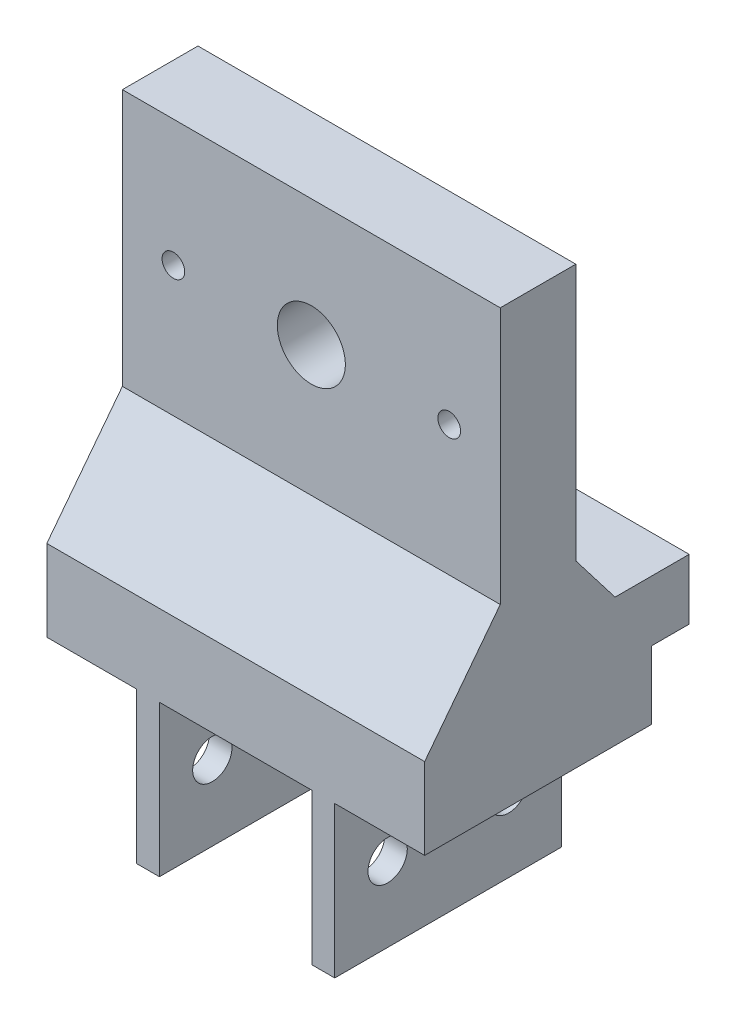
ISO-10303-21;
HEADER;
FILE_DESCRIPTION(('STEP AP214'),'2;1');
FILE_NAME('part.step','',(''),(''),'','','');
FILE_SCHEMA(('AUTOMOTIVE_DESIGN { 1 0 10303 214 1 1 1 1 }'));
ENDSEC;
DATA;
#1=APPLICATION_CONTEXT('core data for automotive mechanical design processes');
#2=APPLICATION_PROTOCOL_DEFINITION('international standard','automotive_design',2000,#1);
#3=PRODUCT_CONTEXT('',#1,'mechanical');
#4=PRODUCT('Part','Part','',(#3));
#5=PRODUCT_RELATED_PRODUCT_CATEGORY('part','',(#4));
#6=PRODUCT_DEFINITION_FORMATION('','',#4);
#7=PRODUCT_DEFINITION_CONTEXT('part definition',#1,'design');
#8=PRODUCT_DEFINITION('design','',#6,#7);
#9=PRODUCT_DEFINITION_SHAPE('','',#8);
#10=(LENGTH_UNIT() NAMED_UNIT(*) SI_UNIT(.MILLI.,.METRE.));
#11=(NAMED_UNIT(*) PLANE_ANGLE_UNIT() SI_UNIT($,.RADIAN.));
#12=(NAMED_UNIT(*) SI_UNIT($,.STERADIAN.) SOLID_ANGLE_UNIT());
#13=UNCERTAINTY_MEASURE_WITH_UNIT(LENGTH_MEASURE(1.E-05),#10,'distance_accuracy_value','');
#14=(GEOMETRIC_REPRESENTATION_CONTEXT(3) GLOBAL_UNCERTAINTY_ASSIGNED_CONTEXT((#13)) GLOBAL_UNIT_ASSIGNED_CONTEXT((#10,
#11,#12)) REPRESENTATION_CONTEXT('',''));
#15=CARTESIAN_POINT('',(0.,0.,0.));
#16=DIRECTION('',(0.,0.,1.));
#17=DIRECTION('',(1.,0.,0.));
#18=AXIS2_PLACEMENT_3D('',#15,#16,#17);
#19=CARTESIAN_POINT('',(13.1,0.,30.));
#20=DIRECTION('',(1.,0.,0.));
#21=DIRECTION('',(0.,1.,0.));
#22=AXIS2_PLACEMENT_3D('',#19,#20,#21);
#23=PLANE('',#22);
#24=CARTESIAN_POINT('',(13.1,-15.375,7.));
#25=DIRECTION('',(1.,0.,0.));
#26=DIRECTION('',(0.,1.,0.));
#27=AXIS2_PLACEMENT_3D('',#24,#25,#26);
#28=CIRCLE('',#27,2.60000000000001);
#29=CARTESIAN_POINT('',(13.1,-12.775,7.));
#30=VERTEX_POINT('',#29);
#31=EDGE_CURVE('E263',#30,#30,#28,.T.);
#32=ORIENTED_EDGE('',*,*,#31,.F.);
#33=EDGE_LOOP('',(#32));
#34=FACE_BOUND('',#33,.T.);
#35=CARTESIAN_POINT('',(13.1,-15.375,23.));
#36=DIRECTION('',(1.,0.,0.));
#37=DIRECTION('',(0.,1.,0.));
#38=AXIS2_PLACEMENT_3D('',#35,#36,#37);
#39=CIRCLE('',#38,2.60000000000001);
#40=CARTESIAN_POINT('',(13.1,-12.775,23.));
#41=VERTEX_POINT('',#40);
#42=EDGE_CURVE('E273',#41,#41,#39,.T.);
#43=ORIENTED_EDGE('',*,*,#42,.F.);
#44=EDGE_LOOP('',(#43));
#45=FACE_BOUND('',#44,.T.);
#46=DIRECTION('',(0.,-1.,0.));
#47=VECTOR('',#46,1.);
#48=CARTESIAN_POINT('',(13.1,0.,0.));
#49=LINE('',#48,#47);
#50=CARTESIAN_POINT('',(13.1,-5.375,0.));
#51=VERTEX_POINT('',#50);
#52=CARTESIAN_POINT('',(13.1,-25.375,0.));
#53=VERTEX_POINT('',#52);
#54=EDGE_CURVE('E285',#51,#53,#49,.T.);
#55=ORIENTED_EDGE('',*,*,#54,.F.);
#56=DIRECTION('',(0.,0.,-1.));
#57=VECTOR('',#56,1.);
#58=CARTESIAN_POINT('',(13.1,-5.375,30.));
#59=LINE('',#58,#57);
#60=CARTESIAN_POINT('',(13.1,-5.375,30.));
#61=VERTEX_POINT('',#60);
#62=EDGE_CURVE('E360',#61,#51,#59,.T.);
#63=ORIENTED_EDGE('',*,*,#62,.F.);
#64=DIRECTION('',(0.,-1.,0.));
#65=VECTOR('',#64,1.);
#66=CARTESIAN_POINT('',(13.1,0.,30.));
#67=LINE('',#66,#65);
#68=CARTESIAN_POINT('',(13.1,-25.375,30.));
#69=VERTEX_POINT('',#68);
#70=EDGE_CURVE('E286',#61,#69,#67,.T.);
#71=ORIENTED_EDGE('',*,*,#70,.T.);
#72=DIRECTION('',(0.,0.,-1.));
#73=VECTOR('',#72,1.);
#74=CARTESIAN_POINT('',(13.1,-25.375,30.));
#75=LINE('',#74,#73);
#76=EDGE_CURVE('E316',#69,#53,#75,.T.);
#77=ORIENTED_EDGE('',*,*,#76,.T.);
#78=EDGE_LOOP('',(#55,#63,#71,#77));
#79=FACE_BOUND('',#78,.T.);
#80=ADVANCED_FACE('F41',(#34,#45,#79),#23,.T.);
#81=CARTESIAN_POINT('',(0.,-5.375,30.));
#82=DIRECTION('',(0.,1.,0.));
#83=DIRECTION('',(0.,0.,1.));
#84=AXIS2_PLACEMENT_3D('',#81,#82,#83);
#85=PLANE('',#84);
#86=DIRECTION('',(1.,0.,0.));
#87=VECTOR('',#86,1.);
#88=CARTESIAN_POINT('',(0.,-5.375,0.));
#89=LINE('',#88,#87);
#90=CARTESIAN_POINT('',(25.,-5.375,0.));
#91=VERTEX_POINT('',#90);
#92=EDGE_CURVE('E319',#51,#91,#89,.T.);
#93=ORIENTED_EDGE('',*,*,#92,.T.);
#94=DIRECTION('',(0.,0.,-1.));
#95=VECTOR('',#94,1.);
#96=CARTESIAN_POINT('',(25.,-5.375,30.));
#97=LINE('',#96,#95);
#98=CARTESIAN_POINT('',(25.,-5.375,30.));
#99=VERTEX_POINT('',#98);
#100=EDGE_CURVE('E358',#99,#91,#97,.T.);
#101=ORIENTED_EDGE('',*,*,#100,.F.);
#102=DIRECTION('',(1.,0.,0.));
#103=VECTOR('',#102,1.);
#104=CARTESIAN_POINT('',(0.,-5.375,30.));
#105=LINE('',#104,#103);
#106=EDGE_CURVE('E289',#61,#99,#105,.T.);
#107=ORIENTED_EDGE('',*,*,#106,.F.);
#108=ORIENTED_EDGE('',*,*,#62,.T.);
#109=EDGE_LOOP('',(#93,#101,#107,#108));
#110=FACE_BOUND('',#109,.T.);
#111=ADVANCED_FACE('F459',(#110),#85,.F.);
#112=CARTESIAN_POINT('',(25.,0.,30.));
#113=DIRECTION('',(-1.,0.,0.));
#114=DIRECTION('',(0.,0.,1.));
#115=AXIS2_PLACEMENT_3D('',#112,#113,#114);
#116=PLANE('',#115);
#117=DIRECTION('',(0.,0.,1.));
#118=VECTOR('',#117,1.);
#119=CARTESIAN_POINT('',(25.,11.625,-5.));
#120=LINE('',#119,#118);
#121=CARTESIAN_POINT('',(25.,11.625,-5.));
#122=VERTEX_POINT('',#121);
#123=CARTESIAN_POINT('',(25.,11.625,4.80769230769231));
#124=VERTEX_POINT('',#123);
#125=EDGE_CURVE('E179',#122,#124,#120,.T.);
#126=ORIENTED_EDGE('',*,*,#125,.T.);
#127=DIRECTION('',(0.,0.7926239891046,0.609710760849693));
#128=VECTOR('',#127,1.);
#129=CARTESIAN_POINT('',(25.,18.375,10.));
#130=LINE('',#129,#128);
#131=CARTESIAN_POINT('',(25.,18.375,10.));
#132=VERTEX_POINT('',#131);
#133=EDGE_CURVE('E215',#124,#132,#130,.T.);
#134=ORIENTED_EDGE('',*,*,#133,.T.);
#135=DIRECTION('',(0.,-1.,0.));
#136=VECTOR('',#135,1.);
#137=CARTESIAN_POINT('',(25.,55.375,10.));
#138=LINE('',#137,#136);
#139=CARTESIAN_POINT('',(25.,52.375,10.));
#140=VERTEX_POINT('',#139);
#141=EDGE_CURVE('E278',#140,#132,#138,.T.);
#142=ORIENTED_EDGE('',*,*,#141,.F.);
#143=DIRECTION('',(0.,0.,1.));
#144=VECTOR('',#143,1.);
#145=CARTESIAN_POINT('',(25.,52.375,20.));
#146=LINE('',#145,#144);
#147=CARTESIAN_POINT('',(25.,52.375,20.));
#148=VERTEX_POINT('',#147);
#149=EDGE_CURVE('E207',#140,#148,#146,.T.);
#150=ORIENTED_EDGE('',*,*,#149,.T.);
#151=DIRECTION('',(0.,-1.,0.));
#152=VECTOR('',#151,1.);
#153=CARTESIAN_POINT('',(25.,55.375,20.));
#154=LINE('',#153,#152);
#155=CARTESIAN_POINT('',(25.,18.375,20.));
#156=VERTEX_POINT('',#155);
#157=EDGE_CURVE('E281',#148,#156,#154,.T.);
#158=ORIENTED_EDGE('',*,*,#157,.T.);
#159=DIRECTION('',(0.,-0.7926239891046,0.609710760849692));
#160=VECTOR('',#159,1.);
#161=CARTESIAN_POINT('',(25.,18.375,20.));
#162=LINE('',#161,#160);
#163=CARTESIAN_POINT('',(25.,5.375,30.));
#164=VERTEX_POINT('',#163);
#165=EDGE_CURVE('E225',#156,#164,#162,.T.);
#166=ORIENTED_EDGE('',*,*,#165,.T.);
#167=DIRECTION('',(0.,1.,0.));
#168=VECTOR('',#167,1.);
#169=CARTESIAN_POINT('',(25.,0.,30.));
#170=LINE('',#169,#168);
#171=EDGE_CURVE('E292',#99,#164,#170,.T.);
#172=ORIENTED_EDGE('',*,*,#171,.F.);
#173=ORIENTED_EDGE('',*,*,#100,.T.);
#174=DIRECTION('',(0.,1.,0.));
#175=VECTOR('',#174,1.);
#176=CARTESIAN_POINT('',(25.,0.,0.));
#177=LINE('',#176,#175);
#178=CARTESIAN_POINT('',(25.,3.625,0.));
#179=VERTEX_POINT('',#178);
#180=EDGE_CURVE('E176',#91,#179,#177,.T.);
#181=ORIENTED_EDGE('',*,*,#180,.T.);
#182=DIRECTION('',(0.,0.,-1.));
#183=VECTOR('',#182,1.);
#184=CARTESIAN_POINT('',(25.,3.625,-5.));
#185=LINE('',#184,#183);
#186=CARTESIAN_POINT('',(25.,3.625,-5.));
#187=VERTEX_POINT('',#186);
#188=EDGE_CURVE('E169',#179,#187,#185,.T.);
#189=ORIENTED_EDGE('',*,*,#188,.T.);
#190=DIRECTION('',(0.,1.,0.));
#191=VECTOR('',#190,1.);
#192=CARTESIAN_POINT('',(25.,3.625,-5.));
#193=LINE('',#192,#191);
#194=EDGE_CURVE('E174',#187,#122,#193,.T.);
#195=ORIENTED_EDGE('',*,*,#194,.T.);
#196=EDGE_LOOP('',(#126,#134,#142,#150,#158,#166,#172,#173,#181,#189,#195));
#197=FACE_BOUND('',#196,.T.);
#198=ADVANCED_FACE('F172',(#197),#116,.F.);
#199=CARTESIAN_POINT('',(-25.,0.,30.));
#200=DIRECTION('',(-1.,0.,0.));
#201=DIRECTION('',(0.,0.,1.));
#202=AXIS2_PLACEMENT_3D('',#199,#200,#201);
#203=PLANE('',#202);
#204=DIRECTION('',(0.,-0.7926239891046,-0.609710760849693));
#205=VECTOR('',#204,1.);
#206=CARTESIAN_POINT('',(-25.,18.375,10.));
#207=LINE('',#206,#205);
#208=CARTESIAN_POINT('',(-25.,18.375,10.));
#209=VERTEX_POINT('',#208);
#210=CARTESIAN_POINT('',(-25.,11.625,4.80769230769231));
#211=VERTEX_POINT('',#210);
#212=EDGE_CURVE('E221',#209,#211,#207,.T.);
#213=ORIENTED_EDGE('',*,*,#212,.T.);
#214=DIRECTION('',(0.,0.,1.));
#215=VECTOR('',#214,1.);
#216=CARTESIAN_POINT('',(-25.,11.625,-5.));
#217=LINE('',#216,#215);
#218=CARTESIAN_POINT('',(-25.,11.625,-5.));
#219=VERTEX_POINT('',#218);
#220=EDGE_CURVE('E178',#219,#211,#217,.T.);
#221=ORIENTED_EDGE('',*,*,#220,.F.);
#222=DIRECTION('',(0.,1.,0.));
#223=VECTOR('',#222,1.);
#224=CARTESIAN_POINT('',(-25.,3.625,-5.));
#225=LINE('',#224,#223);
#226=CARTESIAN_POINT('',(-25.,3.625,-5.));
#227=VERTEX_POINT('',#226);
#228=EDGE_CURVE('E189',#227,#219,#225,.T.);
#229=ORIENTED_EDGE('',*,*,#228,.F.);
#230=DIRECTION('',(0.,0.,-1.));
#231=VECTOR('',#230,1.);
#232=CARTESIAN_POINT('',(-25.,3.625,-5.));
#233=LINE('',#232,#231);
#234=CARTESIAN_POINT('',(-25.,3.625,0.));
#235=VERTEX_POINT('',#234);
#236=EDGE_CURVE('E185',#235,#227,#233,.T.);
#237=ORIENTED_EDGE('',*,*,#236,.F.);
#238=DIRECTION('',(0.,1.,0.));
#239=VECTOR('',#238,1.);
#240=CARTESIAN_POINT('',(-25.,0.,0.));
#241=LINE('',#240,#239);
#242=CARTESIAN_POINT('',(-25.,-5.375,0.));
#243=VERTEX_POINT('',#242);
#244=EDGE_CURVE('E58',#243,#235,#241,.T.);
#245=ORIENTED_EDGE('',*,*,#244,.F.);
#246=DIRECTION('',(0.,0.,-1.));
#247=VECTOR('',#246,1.);
#248=CARTESIAN_POINT('',(-25.,-5.375,30.));
#249=LINE('',#248,#247);
#250=CARTESIAN_POINT('',(-25.,-5.375,30.));
#251=VERTEX_POINT('',#250);
#252=EDGE_CURVE('E356',#251,#243,#249,.T.);
#253=ORIENTED_EDGE('',*,*,#252,.F.);
#254=DIRECTION('',(0.,1.,0.));
#255=VECTOR('',#254,1.);
#256=CARTESIAN_POINT('',(-25.,0.,30.));
#257=LINE('',#256,#255);
#258=CARTESIAN_POINT('',(-25.,5.375,30.));
#259=VERTEX_POINT('',#258);
#260=EDGE_CURVE('E298',#251,#259,#257,.T.);
#261=ORIENTED_EDGE('',*,*,#260,.T.);
#262=DIRECTION('',(0.,0.7926239891046,-0.609710760849692));
#263=VECTOR('',#262,1.);
#264=CARTESIAN_POINT('',(-25.,18.375,20.));
#265=LINE('',#264,#263);
#266=CARTESIAN_POINT('',(-25.,18.375,20.));
#267=VERTEX_POINT('',#266);
#268=EDGE_CURVE('E224',#259,#267,#265,.T.);
#269=ORIENTED_EDGE('',*,*,#268,.T.);
#270=DIRECTION('',(0.,-1.,0.));
#271=VECTOR('',#270,1.);
#272=CARTESIAN_POINT('',(-25.,55.375,20.));
#273=LINE('',#272,#271);
#274=CARTESIAN_POINT('',(-25.,52.375,20.));
#275=VERTEX_POINT('',#274);
#276=EDGE_CURVE('E283',#275,#267,#273,.T.);
#277=ORIENTED_EDGE('',*,*,#276,.F.);
#278=DIRECTION('',(0.,0.,1.));
#279=VECTOR('',#278,1.);
#280=CARTESIAN_POINT('',(-25.,52.375,20.));
#281=LINE('',#280,#279);
#282=CARTESIAN_POINT('',(-25.,52.375,10.));
#283=VERTEX_POINT('',#282);
#284=EDGE_CURVE('E206',#283,#275,#281,.T.);
#285=ORIENTED_EDGE('',*,*,#284,.F.);
#286=DIRECTION('',(0.,-1.,0.));
#287=VECTOR('',#286,1.);
#288=CARTESIAN_POINT('',(-25.,55.375,10.));
#289=LINE('',#288,#287);
#290=EDGE_CURVE('E276',#283,#209,#289,.T.);
#291=ORIENTED_EDGE('',*,*,#290,.T.);
#292=EDGE_LOOP('',(#213,#221,#229,#237,#245,#253,#261,#269,#277,#285,#291));
#293=FACE_BOUND('',#292,.T.);
#294=ADVANCED_FACE('F390',(#293),#203,.T.);
#295=CARTESIAN_POINT('',(0.,-5.375,30.));
#296=DIRECTION('',(0.,1.,0.));
#297=DIRECTION('',(0.,0.,1.));
#298=AXIS2_PLACEMENT_3D('',#295,#296,#297);
#299=PLANE('',#298);
#300=DIRECTION('',(1.,0.,0.));
#301=VECTOR('',#300,1.);
#302=CARTESIAN_POINT('',(0.,-5.375,0.));
#303=LINE('',#302,#301);
#304=CARTESIAN_POINT('',(-13.1,-5.375,0.));
#305=VERTEX_POINT('',#304);
#306=EDGE_CURVE('E323',#243,#305,#303,.T.);
#307=ORIENTED_EDGE('',*,*,#306,.T.);
#308=DIRECTION('',(0.,0.,-1.));
#309=VECTOR('',#308,1.);
#310=CARTESIAN_POINT('',(-13.1,-5.375,30.));
#311=LINE('',#310,#309);
#312=CARTESIAN_POINT('',(-13.1,-5.375,30.));
#313=VERTEX_POINT('',#312);
#314=EDGE_CURVE('E353',#313,#305,#311,.T.);
#315=ORIENTED_EDGE('',*,*,#314,.F.);
#316=DIRECTION('',(1.,0.,0.));
#317=VECTOR('',#316,1.);
#318=CARTESIAN_POINT('',(0.,-5.375,30.));
#319=LINE('',#318,#317);
#320=EDGE_CURVE('E301',#251,#313,#319,.T.);
#321=ORIENTED_EDGE('',*,*,#320,.F.);
#322=ORIENTED_EDGE('',*,*,#252,.T.);
#323=EDGE_LOOP('',(#307,#315,#321,#322));
#324=FACE_BOUND('',#323,.T.);
#325=ADVANCED_FACE('F494',(#324),#299,.F.);
#326=CARTESIAN_POINT('',(-13.1,0.,30.));
#327=DIRECTION('',(1.,0.,0.));
#328=DIRECTION('',(0.,1.,0.));
#329=AXIS2_PLACEMENT_3D('',#326,#327,#328);
#330=PLANE('',#329);
#331=CARTESIAN_POINT('',(-13.1,-15.375,7.));
#332=DIRECTION('',(-1.,0.,0.));
#333=DIRECTION('',(0.,0.,1.));
#334=AXIS2_PLACEMENT_3D('',#331,#332,#333);
#335=CIRCLE('',#334,2.60000000000001);
#336=CARTESIAN_POINT('',(-13.1,-15.375,9.60000000000001));
#337=VERTEX_POINT('',#336);
#338=EDGE_CURVE('E256',#337,#337,#335,.T.);
#339=ORIENTED_EDGE('',*,*,#338,.F.);
#340=EDGE_LOOP('',(#339));
#341=FACE_BOUND('',#340,.T.);
#342=CARTESIAN_POINT('',(-13.1,-15.375,23.));
#343=DIRECTION('',(-1.,0.,0.));
#344=DIRECTION('',(0.,0.,1.));
#345=AXIS2_PLACEMENT_3D('',#342,#343,#344);
#346=CIRCLE('',#345,2.60000000000001);
#347=CARTESIAN_POINT('',(-13.1,-15.375,25.6));
#348=VERTEX_POINT('',#347);
#349=EDGE_CURVE('E266',#348,#348,#346,.T.);
#350=ORIENTED_EDGE('',*,*,#349,.F.);
#351=EDGE_LOOP('',(#350));
#352=FACE_BOUND('',#351,.T.);
#353=DIRECTION('',(0.,-1.,0.));
#354=VECTOR('',#353,1.);
#355=CARTESIAN_POINT('',(-13.1,0.,0.));
#356=LINE('',#355,#354);
#357=CARTESIAN_POINT('',(-13.1,-25.375,0.));
#358=VERTEX_POINT('',#357);
#359=EDGE_CURVE('E325',#305,#358,#356,.T.);
#360=ORIENTED_EDGE('',*,*,#359,.T.);
#361=DIRECTION('',(0.,0.,-1.));
#362=VECTOR('',#361,1.);
#363=CARTESIAN_POINT('',(-13.1,-25.375,30.));
#364=LINE('',#363,#362);
#365=CARTESIAN_POINT('',(-13.1,-25.375,30.));
#366=VERTEX_POINT('',#365);
#367=EDGE_CURVE('E350',#366,#358,#364,.T.);
#368=ORIENTED_EDGE('',*,*,#367,.F.);
#369=DIRECTION('',(0.,-1.,0.));
#370=VECTOR('',#369,1.);
#371=CARTESIAN_POINT('',(-13.1,0.,30.));
#372=LINE('',#371,#370);
#373=EDGE_CURVE('E303',#313,#366,#372,.T.);
#374=ORIENTED_EDGE('',*,*,#373,.F.);
#375=ORIENTED_EDGE('',*,*,#314,.T.);
#376=EDGE_LOOP('',(#360,#368,#374,#375));
#377=FACE_BOUND('',#376,.T.);
#378=ADVANCED_FACE('F441',(#341,#352,#377),#330,.F.);
#379=CARTESIAN_POINT('',(0.,-25.375,30.));
#380=DIRECTION('',(0.,1.,0.));
#381=DIRECTION('',(0.,0.,1.));
#382=AXIS2_PLACEMENT_3D('',#379,#380,#381);
#383=PLANE('',#382);
#384=DIRECTION('',(1.,0.,0.));
#385=VECTOR('',#384,1.);
#386=CARTESIAN_POINT('',(0.,-25.375,0.));
#387=LINE('',#386,#385);
#388=CARTESIAN_POINT('',(-10.1,-25.375,0.));
#389=VERTEX_POINT('',#388);
#390=EDGE_CURVE('E327',#358,#389,#387,.T.);
#391=ORIENTED_EDGE('',*,*,#390,.T.);
#392=DIRECTION('',(0.,0.,-1.));
#393=VECTOR('',#392,1.);
#394=CARTESIAN_POINT('',(-10.1,-25.375,30.));
#395=LINE('',#394,#393);
#396=CARTESIAN_POINT('',(-10.1,-25.375,30.));
#397=VERTEX_POINT('',#396);
#398=EDGE_CURVE('E347',#397,#389,#395,.T.);
#399=ORIENTED_EDGE('',*,*,#398,.F.);
#400=DIRECTION('',(1.,0.,0.));
#401=VECTOR('',#400,1.);
#402=CARTESIAN_POINT('',(0.,-25.375,30.));
#403=LINE('',#402,#401);
#404=EDGE_CURVE('E305',#366,#397,#403,.T.);
#405=ORIENTED_EDGE('',*,*,#404,.F.);
#406=ORIENTED_EDGE('',*,*,#367,.T.);
#407=EDGE_LOOP('',(#391,#399,#405,#406));
#408=FACE_BOUND('',#407,.T.);
#409=ADVANCED_FACE('F437',(#408),#383,.F.);
#410=CARTESIAN_POINT('',(-10.1,0.,30.));
#411=DIRECTION('',(-1.,0.,0.));
#412=DIRECTION('',(0.,0.,1.));
#413=AXIS2_PLACEMENT_3D('',#410,#411,#412);
#414=PLANE('',#413);
#415=CARTESIAN_POINT('',(-10.1,-15.375,7.));
#416=DIRECTION('',(-1.,0.,0.));
#417=DIRECTION('',(0.,0.,1.));
#418=AXIS2_PLACEMENT_3D('',#415,#416,#417);
#419=CIRCLE('',#418,2.60000000000001);
#420=CARTESIAN_POINT('',(-10.1,-15.375,9.60000000000001));
#421=VERTEX_POINT('',#420);
#422=EDGE_CURVE('E259',#421,#421,#419,.T.);
#423=ORIENTED_EDGE('',*,*,#422,.T.);
#424=EDGE_LOOP('',(#423));
#425=FACE_BOUND('',#424,.T.);
#426=CARTESIAN_POINT('',(-10.1,-15.375,23.));
#427=DIRECTION('',(-1.,0.,0.));
#428=DIRECTION('',(0.,0.,1.));
#429=AXIS2_PLACEMENT_3D('',#426,#427,#428);
#430=CIRCLE('',#429,2.60000000000001);
#431=CARTESIAN_POINT('',(-10.1,-15.375,25.6));
#432=VERTEX_POINT('',#431);
#433=EDGE_CURVE('E269',#432,#432,#430,.T.);
#434=ORIENTED_EDGE('',*,*,#433,.T.);
#435=EDGE_LOOP('',(#434));
#436=FACE_BOUND('',#435,.T.);
#437=DIRECTION('',(0.,1.,0.));
#438=VECTOR('',#437,1.);
#439=CARTESIAN_POINT('',(-10.1,0.,0.));
#440=LINE('',#439,#438);
#441=CARTESIAN_POINT('',(-10.1,-5.375,0.));
#442=VERTEX_POINT('',#441);
#443=EDGE_CURVE('E329',#389,#442,#440,.T.);
#444=ORIENTED_EDGE('',*,*,#443,.T.);
#445=DIRECTION('',(0.,0.,-1.));
#446=VECTOR('',#445,1.);
#447=CARTESIAN_POINT('',(-10.1,-5.375,30.));
#448=LINE('',#447,#446);
#449=CARTESIAN_POINT('',(-10.1,-5.375,30.));
#450=VERTEX_POINT('',#449);
#451=EDGE_CURVE('E344',#450,#442,#448,.T.);
#452=ORIENTED_EDGE('',*,*,#451,.F.);
#453=DIRECTION('',(0.,1.,0.));
#454=VECTOR('',#453,1.);
#455=CARTESIAN_POINT('',(-10.1,0.,30.));
#456=LINE('',#455,#454);
#457=EDGE_CURVE('E307',#397,#450,#456,.T.);
#458=ORIENTED_EDGE('',*,*,#457,.F.);
#459=ORIENTED_EDGE('',*,*,#398,.T.);
#460=EDGE_LOOP('',(#444,#452,#458,#459));
#461=FACE_BOUND('',#460,.T.);
#462=ADVANCED_FACE('F432',(#425,#436,#461),#414,.F.);
#463=CARTESIAN_POINT('',(0.,-5.375,30.));
#464=DIRECTION('',(0.,1.,0.));
#465=DIRECTION('',(0.,0.,1.));
#466=AXIS2_PLACEMENT_3D('',#463,#464,#465);
#467=PLANE('',#466);
#468=DIRECTION('',(1.,0.,0.));
#469=VECTOR('',#468,1.);
#470=CARTESIAN_POINT('',(0.,-5.375,0.));
#471=LINE('',#470,#469);
#472=CARTESIAN_POINT('',(10.1,-5.375,0.));
#473=VERTEX_POINT('',#472);
#474=EDGE_CURVE('E331',#442,#473,#471,.T.);
#475=ORIENTED_EDGE('',*,*,#474,.T.);
#476=DIRECTION('',(0.,0.,-1.));
#477=VECTOR('',#476,1.);
#478=CARTESIAN_POINT('',(10.1,-5.375,30.));
#479=LINE('',#478,#477);
#480=CARTESIAN_POINT('',(10.1,-5.375,30.));
#481=VERTEX_POINT('',#480);
#482=EDGE_CURVE('E342',#481,#473,#479,.T.);
#483=ORIENTED_EDGE('',*,*,#482,.F.);
#484=DIRECTION('',(1.,0.,0.));
#485=VECTOR('',#484,1.);
#486=CARTESIAN_POINT('',(0.,-5.375,30.));
#487=LINE('',#486,#485);
#488=EDGE_CURVE('E309',#450,#481,#487,.T.);
#489=ORIENTED_EDGE('',*,*,#488,.F.);
#490=ORIENTED_EDGE('',*,*,#451,.T.);
#491=EDGE_LOOP('',(#475,#483,#489,#490));
#492=FACE_BOUND('',#491,.T.);
#493=ADVANCED_FACE('F426',(#492),#467,.F.);
#494=CARTESIAN_POINT('',(10.1,0.,30.));
#495=DIRECTION('',(-1.,0.,0.));
#496=DIRECTION('',(0.,0.,1.));
#497=AXIS2_PLACEMENT_3D('',#494,#495,#496);
#498=PLANE('',#497);
#499=CARTESIAN_POINT('',(10.1,-15.375,7.));
#500=DIRECTION('',(-1.,0.,0.));
#501=DIRECTION('',(0.,0.,1.));
#502=AXIS2_PLACEMENT_3D('',#499,#500,#501);
#503=CIRCLE('',#502,2.60000000000001);
#504=CARTESIAN_POINT('',(10.1,-15.375,9.60000000000001));
#505=VERTEX_POINT('',#504);
#506=EDGE_CURVE('E260',#505,#505,#503,.T.);
#507=ORIENTED_EDGE('',*,*,#506,.F.);
#508=EDGE_LOOP('',(#507));
#509=FACE_BOUND('',#508,.T.);
#510=CARTESIAN_POINT('',(10.1,-15.375,23.));
#511=DIRECTION('',(-1.,0.,0.));
#512=DIRECTION('',(0.,0.,1.));
#513=AXIS2_PLACEMENT_3D('',#510,#511,#512);
#514=CIRCLE('',#513,2.60000000000001);
#515=CARTESIAN_POINT('',(10.1,-15.375,25.6));
#516=VERTEX_POINT('',#515);
#517=EDGE_CURVE('E270',#516,#516,#514,.T.);
#518=ORIENTED_EDGE('',*,*,#517,.F.);
#519=EDGE_LOOP('',(#518));
#520=FACE_BOUND('',#519,.T.);
#521=DIRECTION('',(0.,1.,0.));
#522=VECTOR('',#521,1.);
#523=CARTESIAN_POINT('',(10.1,0.,0.));
#524=LINE('',#523,#522);
#525=CARTESIAN_POINT('',(10.1,-25.375,0.));
#526=VERTEX_POINT('',#525);
#527=EDGE_CURVE('E334',#526,#473,#524,.T.);
#528=ORIENTED_EDGE('',*,*,#527,.F.);
#529=DIRECTION('',(0.,0.,-1.));
#530=VECTOR('',#529,1.);
#531=CARTESIAN_POINT('',(10.1,-25.375,30.));
#532=LINE('',#531,#530);
#533=CARTESIAN_POINT('',(10.1,-25.375,30.));
#534=VERTEX_POINT('',#533);
#535=EDGE_CURVE('E340',#534,#526,#532,.T.);
#536=ORIENTED_EDGE('',*,*,#535,.F.);
#537=DIRECTION('',(0.,1.,0.));
#538=VECTOR('',#537,1.);
#539=CARTESIAN_POINT('',(10.1,0.,30.));
#540=LINE('',#539,#538);
#541=EDGE_CURVE('E311',#534,#481,#540,.T.);
#542=ORIENTED_EDGE('',*,*,#541,.T.);
#543=ORIENTED_EDGE('',*,*,#482,.T.);
#544=EDGE_LOOP('',(#528,#536,#542,#543));
#545=FACE_BOUND('',#544,.T.);
#546=ADVANCED_FACE('F421',(#509,#520,#545),#498,.T.);
#547=CARTESIAN_POINT('',(0.,-25.375,30.));
#548=DIRECTION('',(0.,1.,0.));
#549=DIRECTION('',(0.,0.,1.));
#550=AXIS2_PLACEMENT_3D('',#547,#548,#549);
#551=PLANE('',#550);
#552=DIRECTION('',(1.,0.,0.));
#553=VECTOR('',#552,1.);
#554=CARTESIAN_POINT('',(0.,-25.375,0.));
#555=LINE('',#554,#553);
#556=EDGE_CURVE('E290',#526,#53,#555,.T.);
#557=ORIENTED_EDGE('',*,*,#556,.T.);
#558=ORIENTED_EDGE('',*,*,#76,.F.);
#559=DIRECTION('',(1.,0.,0.));
#560=VECTOR('',#559,1.);
#561=CARTESIAN_POINT('',(0.,-25.375,30.));
#562=LINE('',#561,#560);
#563=EDGE_CURVE('E314',#534,#69,#562,.T.);
#564=ORIENTED_EDGE('',*,*,#563,.F.);
#565=ORIENTED_EDGE('',*,*,#535,.T.);
#566=EDGE_LOOP('',(#557,#558,#564,#565));
#567=FACE_BOUND('',#566,.T.);
#568=ADVANCED_FACE('F417',(#567),#551,.F.);
#569=CARTESIAN_POINT('',(0.,0.,30.));
#570=DIRECTION('',(0.,0.,1.));
#571=DIRECTION('',(1.,0.,0.));
#572=AXIS2_PLACEMENT_3D('',#569,#570,#571);
#573=PLANE('',#572);
#574=ORIENTED_EDGE('',*,*,#70,.F.);
#575=ORIENTED_EDGE('',*,*,#106,.T.);
#576=ORIENTED_EDGE('',*,*,#171,.T.);
#577=DIRECTION('',(1.,0.,0.));
#578=VECTOR('',#577,1.);
#579=CARTESIAN_POINT('',(0.,5.375,30.));
#580=LINE('',#579,#578);
#581=EDGE_CURVE('E295',#259,#164,#580,.T.);
#582=ORIENTED_EDGE('',*,*,#581,.F.);
#583=ORIENTED_EDGE('',*,*,#260,.F.);
#584=ORIENTED_EDGE('',*,*,#320,.T.);
#585=ORIENTED_EDGE('',*,*,#373,.T.);
#586=ORIENTED_EDGE('',*,*,#404,.T.);
#587=ORIENTED_EDGE('',*,*,#457,.T.);
#588=ORIENTED_EDGE('',*,*,#488,.T.);
#589=ORIENTED_EDGE('',*,*,#541,.F.);
#590=ORIENTED_EDGE('',*,*,#563,.T.);
#591=EDGE_LOOP('',(#574,#575,#576,#582,#583,#584,#585,#586,#587,#588,#589,#590));
#592=FACE_BOUND('',#591,.T.);
#593=ADVANCED_FACE('F405',(#592),#573,.T.);
#594=CARTESIAN_POINT('',(0.,0.,0.));
#595=DIRECTION('',(0.,0.,1.));
#596=DIRECTION('',(1.,0.,0.));
#597=AXIS2_PLACEMENT_3D('',#594,#595,#596);
#598=PLANE('',#597);
#599=ORIENTED_EDGE('',*,*,#244,.T.);
#600=DIRECTION('',(1.,0.,0.));
#601=VECTOR('',#600,1.);
#602=CARTESIAN_POINT('',(0.,3.625,0.));
#603=LINE('',#602,#601);
#604=EDGE_CURVE('E11',#235,#179,#603,.T.);
#605=ORIENTED_EDGE('',*,*,#604,.T.);
#606=ORIENTED_EDGE('',*,*,#180,.F.);
#607=ORIENTED_EDGE('',*,*,#92,.F.);
#608=ORIENTED_EDGE('',*,*,#54,.T.);
#609=ORIENTED_EDGE('',*,*,#556,.F.);
#610=ORIENTED_EDGE('',*,*,#527,.T.);
#611=ORIENTED_EDGE('',*,*,#474,.F.);
#612=ORIENTED_EDGE('',*,*,#443,.F.);
#613=ORIENTED_EDGE('',*,*,#390,.F.);
#614=ORIENTED_EDGE('',*,*,#359,.F.);
#615=ORIENTED_EDGE('',*,*,#306,.F.);
#616=EDGE_LOOP('',(#599,#605,#606,#607,#608,#609,#610,#611,#612,#613,#614,#615));
#617=FACE_BOUND('',#616,.T.);
#618=ADVANCED_FACE('F410',(#617),#598,.F.);
#619=CARTESIAN_POINT('',(-25.,55.375,20.));
#620=DIRECTION('',(0.,0.,-1.));
#621=DIRECTION('',(-1.,0.,0.));
#622=AXIS2_PLACEMENT_3D('',#619,#620,#621);
#623=PLANE('',#622);
#624=CARTESIAN_POINT('',(-18.25,35.625,20.));
#625=DIRECTION('',(0.,0.,-1.));
#626=DIRECTION('',(-1.,0.,0.));
#627=AXIS2_PLACEMENT_3D('',#624,#625,#626);
#628=CIRCLE('',#627,1.50000000000001);
#629=CARTESIAN_POINT('',(-19.75,35.625,20.));
#630=VERTEX_POINT('',#629);
#631=EDGE_CURVE('E235',#630,#630,#628,.T.);
#632=ORIENTED_EDGE('',*,*,#631,.T.);
#633=EDGE_LOOP('',(#632));
#634=FACE_BOUND('',#633,.T.);
#635=CARTESIAN_POINT('',(18.25,35.625,20.));
#636=DIRECTION('',(0.,0.,-1.));
#637=DIRECTION('',(-1.,0.,0.));
#638=AXIS2_PLACEMENT_3D('',#635,#636,#637);
#639=CIRCLE('',#638,1.50000000000001);
#640=CARTESIAN_POINT('',(16.75,35.625,20.));
#641=VERTEX_POINT('',#640);
#642=EDGE_CURVE('E241',#641,#641,#639,.T.);
#643=ORIENTED_EDGE('',*,*,#642,.T.);
#644=EDGE_LOOP('',(#643));
#645=FACE_BOUND('',#644,.T.);
#646=CARTESIAN_POINT('',(0.,35.625,20.));
#647=DIRECTION('',(0.,0.,-1.));
#648=DIRECTION('',(-1.,0.,0.));
#649=AXIS2_PLACEMENT_3D('',#646,#647,#648);
#650=CIRCLE('',#649,4.50000000000001);
#651=CARTESIAN_POINT('',(-4.50000000000002,35.625,20.));
#652=VERTEX_POINT('',#651);
#653=EDGE_CURVE('E253',#652,#652,#650,.T.);
#654=ORIENTED_EDGE('',*,*,#653,.T.);
#655=EDGE_LOOP('',(#654));
#656=FACE_BOUND('',#655,.T.);
#657=ORIENTED_EDGE('',*,*,#157,.F.);
#658=DIRECTION('',(-1.,0.,0.));
#659=VECTOR('',#658,1.);
#660=CARTESIAN_POINT('',(25.,52.375,20.));
#661=LINE('',#660,#659);
#662=EDGE_CURVE('E212',#148,#275,#661,.T.);
#663=ORIENTED_EDGE('',*,*,#662,.T.);
#664=ORIENTED_EDGE('',*,*,#276,.T.);
#665=DIRECTION('',(-1.,0.,0.));
#666=VECTOR('',#665,1.);
#667=CARTESIAN_POINT('',(41.4012194668567,18.375,20.));
#668=LINE('',#667,#666);
#669=EDGE_CURVE('E228',#156,#267,#668,.T.);
#670=ORIENTED_EDGE('',*,*,#669,.F.);
#671=EDGE_LOOP('',(#657,#663,#664,#670));
#672=FACE_BOUND('',#671,.T.);
#673=ADVANCED_FACE('F377',(#634,#645,#656,#672),#623,.F.);
#674=CARTESIAN_POINT('',(-25.,55.375,10.));
#675=DIRECTION('',(0.,0.,1.));
#676=DIRECTION('',(1.,0.,0.));
#677=AXIS2_PLACEMENT_3D('',#674,#675,#676);
#678=PLANE('',#677);
#679=CARTESIAN_POINT('',(18.25,35.625,10.));
#680=DIRECTION('',(0.,0.,1.));
#681=DIRECTION('',(1.,0.,0.));
#682=AXIS2_PLACEMENT_3D('',#679,#680,#681);
#683=CIRCLE('',#682,2.45);
#684=CARTESIAN_POINT('',(20.7,35.625,10.));
#685=VERTEX_POINT('',#684);
#686=EDGE_CURVE('E48',#685,#685,#683,.F.);
#687=ORIENTED_EDGE('',*,*,#686,.F.);
#688=EDGE_LOOP('',(#687));
#689=FACE_BOUND('',#688,.T.);
#690=CARTESIAN_POINT('',(-18.25,35.625,10.));
#691=DIRECTION('',(0.,0.,1.));
#692=DIRECTION('',(1.,0.,0.));
#693=AXIS2_PLACEMENT_3D('',#690,#691,#692);
#694=CIRCLE('',#693,2.45);
#695=CARTESIAN_POINT('',(-15.8,35.625,10.));
#696=VERTEX_POINT('',#695);
#697=EDGE_CURVE('E362',#696,#696,#694,.F.);
#698=ORIENTED_EDGE('',*,*,#697,.F.);
#699=EDGE_LOOP('',(#698));
#700=FACE_BOUND('',#699,.T.);
#701=CARTESIAN_POINT('',(0.,35.625,10.));
#702=DIRECTION('',(0.,0.,-1.));
#703=DIRECTION('',(-1.,0.,0.));
#704=AXIS2_PLACEMENT_3D('',#701,#702,#703);
#705=CIRCLE('',#704,4.50000000000001);
#706=CARTESIAN_POINT('',(-4.50000000000002,35.625,10.));
#707=VERTEX_POINT('',#706);
#708=EDGE_CURVE('E250',#707,#707,#705,.T.);
#709=ORIENTED_EDGE('',*,*,#708,.F.);
#710=EDGE_LOOP('',(#709));
#711=FACE_BOUND('',#710,.T.);
#712=ORIENTED_EDGE('',*,*,#290,.F.);
#713=DIRECTION('',(-1.,0.,0.));
#714=VECTOR('',#713,1.);
#715=CARTESIAN_POINT('',(25.,52.375,10.));
#716=LINE('',#715,#714);
#717=EDGE_CURVE('E210',#140,#283,#716,.T.);
#718=ORIENTED_EDGE('',*,*,#717,.F.);
#719=ORIENTED_EDGE('',*,*,#141,.T.);
#720=DIRECTION('',(-1.,0.,0.));
#721=VECTOR('',#720,1.);
#722=CARTESIAN_POINT('',(41.4012194668567,18.375,10.));
#723=LINE('',#722,#721);
#724=EDGE_CURVE('E218',#132,#209,#723,.T.);
#725=ORIENTED_EDGE('',*,*,#724,.T.);
#726=EDGE_LOOP('',(#712,#718,#719,#725));
#727=FACE_BOUND('',#726,.T.);
#728=ADVANCED_FACE('F373',(#689,#700,#711,#727),#678,.F.);
#729=CARTESIAN_POINT('',(-13.1,-15.375,23.));
#730=DIRECTION('',(-1.,0.,0.));
#731=DIRECTION('',(0.,0.,1.));
#732=AXIS2_PLACEMENT_3D('',#729,#730,#731);
#733=CYLINDRICAL_SURFACE('',#732,2.60000000000001);
#734=ORIENTED_EDGE('',*,*,#349,.T.);
#735=EDGE_LOOP('',(#734));
#736=FACE_BOUND('',#735,.T.);
#737=ORIENTED_EDGE('',*,*,#433,.F.);
#738=EDGE_LOOP('',(#737));
#739=FACE_BOUND('',#738,.T.);
#740=ADVANCED_FACE('F376',(#736,#739),#733,.F.);
#741=ORIENTED_EDGE('',*,*,#42,.T.);
#742=EDGE_LOOP('',(#741));
#743=FACE_BOUND('',#742,.T.);
#744=ORIENTED_EDGE('',*,*,#517,.T.);
#745=EDGE_LOOP('',(#744));
#746=FACE_BOUND('',#745,.T.);
#747=ADVANCED_FACE('F468',(#743,#746),#733,.F.);
#748=CARTESIAN_POINT('',(-13.1,-15.375,7.));
#749=DIRECTION('',(-1.,0.,0.));
#750=DIRECTION('',(0.,0.,1.));
#751=AXIS2_PLACEMENT_3D('',#748,#749,#750);
#752=CYLINDRICAL_SURFACE('',#751,2.60000000000001);
#753=ORIENTED_EDGE('',*,*,#338,.T.);
#754=EDGE_LOOP('',(#753));
#755=FACE_BOUND('',#754,.T.);
#756=ORIENTED_EDGE('',*,*,#422,.F.);
#757=EDGE_LOOP('',(#756));
#758=FACE_BOUND('',#757,.T.);
#759=ADVANCED_FACE('F471',(#755,#758),#752,.F.);
#760=ORIENTED_EDGE('',*,*,#31,.T.);
#761=EDGE_LOOP('',(#760));
#762=FACE_BOUND('',#761,.T.);
#763=ORIENTED_EDGE('',*,*,#506,.T.);
#764=EDGE_LOOP('',(#763));
#765=FACE_BOUND('',#764,.T.);
#766=ADVANCED_FACE('F650',(#762,#765),#752,.F.);
#767=CARTESIAN_POINT('',(0.,35.625,10.));
#768=DIRECTION('',(0.,0.,-1.));
#769=DIRECTION('',(-1.,0.,0.));
#770=AXIS2_PLACEMENT_3D('',#767,#768,#769);
#771=CYLINDRICAL_SURFACE('',#770,4.50000000000001);
#772=ORIENTED_EDGE('',*,*,#708,.T.);
#773=EDGE_LOOP('',(#772));
#774=FACE_BOUND('',#773,.T.);
#775=ORIENTED_EDGE('',*,*,#653,.F.);
#776=EDGE_LOOP('',(#775));
#777=FACE_BOUND('',#776,.T.);
#778=ADVANCED_FACE('F660',(#774,#777),#771,.F.);
#779=CARTESIAN_POINT('',(-18.25,35.625,6.));
#780=DIRECTION('',(0.,0.,1.));
#781=DIRECTION('',(1.,0.,0.));
#782=AXIS2_PLACEMENT_3D('',#779,#780,#781);
#783=CYLINDRICAL_SURFACE('',#782,2.45);
#784=CARTESIAN_POINT('',(-18.25,35.625,6.));
#785=DIRECTION('',(0.,0.,-1.));
#786=DIRECTION('',(-1.,0.,0.));
#787=AXIS2_PLACEMENT_3D('',#784,#785,#786);
#788=CIRCLE('',#787,2.45);
#789=CARTESIAN_POINT('',(-20.7,35.625,6.));
#790=VERTEX_POINT('',#789);
#791=EDGE_CURVE('E247',#790,#790,#788,.T.);
#792=ORIENTED_EDGE('',*,*,#791,.F.);
#793=EDGE_LOOP('',(#792));
#794=FACE_BOUND('',#793,.T.);
#795=ORIENTED_EDGE('',*,*,#697,.T.);
#796=EDGE_LOOP('',(#795));
#797=FACE_BOUND('',#796,.T.);
#798=ADVANCED_FACE('F669',(#794,#797),#783,.T.);
#799=CARTESIAN_POINT('',(-18.25,35.625,6.));
#800=DIRECTION('',(0.,0.,-1.));
#801=DIRECTION('',(-1.,0.,0.));
#802=AXIS2_PLACEMENT_3D('',#799,#800,#801);
#803=PLANE('',#802);
#804=CARTESIAN_POINT('',(-18.25,35.625,6.));
#805=DIRECTION('',(0.,0.,-1.));
#806=DIRECTION('',(-1.,0.,0.));
#807=AXIS2_PLACEMENT_3D('',#804,#805,#806);
#808=CIRCLE('',#807,1.50000000000002);
#809=CARTESIAN_POINT('',(-19.75,35.625,6.));
#810=VERTEX_POINT('',#809);
#811=EDGE_CURVE('E227',#810,#810,#808,.T.);
#812=ORIENTED_EDGE('',*,*,#811,.F.);
#813=EDGE_LOOP('',(#812));
#814=FACE_BOUND('',#813,.T.);
#815=ORIENTED_EDGE('',*,*,#791,.T.);
#816=EDGE_LOOP('',(#815));
#817=FACE_BOUND('',#816,.T.);
#818=ADVANCED_FACE('F679',(#814,#817),#803,.T.);
#819=CARTESIAN_POINT('',(18.25,35.625,6.));
#820=DIRECTION('',(0.,0.,1.));
#821=DIRECTION('',(1.,0.,0.));
#822=AXIS2_PLACEMENT_3D('',#819,#820,#821);
#823=CYLINDRICAL_SURFACE('',#822,2.45);
#824=CARTESIAN_POINT('',(18.25,35.625,6.));
#825=DIRECTION('',(0.,0.,-1.));
#826=DIRECTION('',(-1.,0.,0.));
#827=AXIS2_PLACEMENT_3D('',#824,#825,#826);
#828=CIRCLE('',#827,2.45);
#829=CARTESIAN_POINT('',(15.8,35.625,6.));
#830=VERTEX_POINT('',#829);
#831=EDGE_CURVE('E244',#830,#830,#828,.T.);
#832=ORIENTED_EDGE('',*,*,#831,.F.);
#833=EDGE_LOOP('',(#832));
#834=FACE_BOUND('',#833,.T.);
#835=ORIENTED_EDGE('',*,*,#686,.T.);
#836=EDGE_LOOP('',(#835));
#837=FACE_BOUND('',#836,.T.);
#838=ADVANCED_FACE('F371',(#834,#837),#823,.T.);
#839=CARTESIAN_POINT('',(18.25,35.625,6.));
#840=DIRECTION('',(0.,0.,-1.));
#841=DIRECTION('',(-1.,0.,0.));
#842=AXIS2_PLACEMENT_3D('',#839,#840,#841);
#843=PLANE('',#842);
#844=CARTESIAN_POINT('',(18.25,35.625,6.));
#845=DIRECTION('',(0.,0.,-1.));
#846=DIRECTION('',(-1.,0.,0.));
#847=AXIS2_PLACEMENT_3D('',#844,#845,#846);
#848=CIRCLE('',#847,1.50000000000002);
#849=CARTESIAN_POINT('',(16.75,35.625,6.));
#850=VERTEX_POINT('',#849);
#851=EDGE_CURVE('E238',#850,#850,#848,.T.);
#852=ORIENTED_EDGE('',*,*,#851,.F.);
#853=EDGE_LOOP('',(#852));
#854=FACE_BOUND('',#853,.T.);
#855=ORIENTED_EDGE('',*,*,#831,.T.);
#856=EDGE_LOOP('',(#855));
#857=FACE_BOUND('',#856,.T.);
#858=ADVANCED_FACE('F698',(#854,#857),#843,.T.);
#859=CARTESIAN_POINT('',(18.25,35.625,6.));
#860=DIRECTION('',(0.,0.,-1.));
#861=DIRECTION('',(-1.,0.,0.));
#862=AXIS2_PLACEMENT_3D('',#859,#860,#861);
#863=CYLINDRICAL_SURFACE('',#862,1.50000000000001);
#864=ORIENTED_EDGE('',*,*,#851,.T.);
#865=EDGE_LOOP('',(#864));
#866=FACE_BOUND('',#865,.T.);
#867=ORIENTED_EDGE('',*,*,#642,.F.);
#868=EDGE_LOOP('',(#867));
#869=FACE_BOUND('',#868,.T.);
#870=ADVANCED_FACE('F708',(#866,#869),#863,.F.);
#871=CARTESIAN_POINT('',(-18.25,35.625,6.));
#872=DIRECTION('',(0.,0.,-1.));
#873=DIRECTION('',(-1.,0.,0.));
#874=AXIS2_PLACEMENT_3D('',#871,#872,#873);
#875=CYLINDRICAL_SURFACE('',#874,1.50000000000001);
#876=ORIENTED_EDGE('',*,*,#811,.T.);
#877=EDGE_LOOP('',(#876));
#878=FACE_BOUND('',#877,.T.);
#879=ORIENTED_EDGE('',*,*,#631,.F.);
#880=EDGE_LOOP('',(#879));
#881=FACE_BOUND('',#880,.T.);
#882=ADVANCED_FACE('F456',(#878,#881),#875,.F.);
#883=CARTESIAN_POINT('',(41.4012194668567,18.375,20.));
#884=DIRECTION('',(0.,0.609710760849692,0.7926239891046));
#885=DIRECTION('',(0.,-0.7926239891046,0.609710760849692));
#886=AXIS2_PLACEMENT_3D('',#883,#884,#885);
#887=PLANE('',#886);
#888=ORIENTED_EDGE('',*,*,#165,.F.);
#889=ORIENTED_EDGE('',*,*,#669,.T.);
#890=ORIENTED_EDGE('',*,*,#268,.F.);
#891=ORIENTED_EDGE('',*,*,#581,.T.);
#892=EDGE_LOOP('',(#888,#889,#890,#891));
#893=FACE_BOUND('',#892,.T.);
#894=ADVANCED_FACE('F400',(#893),#887,.T.);
#895=CARTESIAN_POINT('',(41.4012194668567,18.375,10.));
#896=DIRECTION('',(0.,0.609710760849693,-0.7926239891046));
#897=DIRECTION('',(0.,0.7926239891046,0.609710760849693));
#898=AXIS2_PLACEMENT_3D('',#895,#896,#897);
#899=PLANE('',#898);
#900=DIRECTION('',(1.,0.,0.));
#901=VECTOR('',#900,1.);
#902=CARTESIAN_POINT('',(-37.6566515477976,11.625,4.80769230769231));
#903=LINE('',#902,#901);
#904=EDGE_CURVE('E200',#211,#124,#903,.T.);
#905=ORIENTED_EDGE('',*,*,#904,.F.);
#906=ORIENTED_EDGE('',*,*,#212,.F.);
#907=ORIENTED_EDGE('',*,*,#724,.F.);
#908=ORIENTED_EDGE('',*,*,#133,.F.);
#909=EDGE_LOOP('',(#905,#906,#907,#908));
#910=FACE_BOUND('',#909,.T.);
#911=ADVANCED_FACE('F448',(#910),#899,.T.);
#912=CARTESIAN_POINT('',(25.,52.375,20.));
#913=DIRECTION('',(0.,-1.,0.));
#914=DIRECTION('',(0.,0.,-1.));
#915=AXIS2_PLACEMENT_3D('',#912,#913,#914);
#916=PLANE('',#915);
#917=ORIENTED_EDGE('',*,*,#284,.T.);
#918=ORIENTED_EDGE('',*,*,#662,.F.);
#919=ORIENTED_EDGE('',*,*,#149,.F.);
#920=ORIENTED_EDGE('',*,*,#717,.T.);
#921=EDGE_LOOP('',(#917,#918,#919,#920));
#922=FACE_BOUND('',#921,.T.);
#923=ADVANCED_FACE('F393',(#922),#916,.F.);
#924=CARTESIAN_POINT('',(-37.6566515477976,3.625,-5.));
#925=DIRECTION('',(0.,-1.,0.));
#926=DIRECTION('',(0.,0.,-1.));
#927=AXIS2_PLACEMENT_3D('',#924,#925,#926);
#928=PLANE('',#927);
#929=ORIENTED_EDGE('',*,*,#604,.F.);
#930=ORIENTED_EDGE('',*,*,#236,.T.);
#931=DIRECTION('',(1.,0.,0.));
#932=VECTOR('',#931,1.);
#933=CARTESIAN_POINT('',(-37.6566515477976,3.625,-5.));
#934=LINE('',#933,#932);
#935=EDGE_CURVE('E182',#227,#187,#934,.T.);
#936=ORIENTED_EDGE('',*,*,#935,.T.);
#937=ORIENTED_EDGE('',*,*,#188,.F.);
#938=EDGE_LOOP('',(#929,#930,#936,#937));
#939=FACE_BOUND('',#938,.T.);
#940=ADVANCED_FACE('F183',(#939),#928,.T.);
#941=CARTESIAN_POINT('',(-37.6566515477976,11.625,-5.));
#942=DIRECTION('',(0.,1.,0.));
#943=DIRECTION('',(0.,0.,1.));
#944=AXIS2_PLACEMENT_3D('',#941,#942,#943);
#945=PLANE('',#944);
#946=DIRECTION('',(1.,0.,0.));
#947=VECTOR('',#946,1.);
#948=CARTESIAN_POINT('',(-37.6566515477976,11.625,-5.));
#949=LINE('',#948,#947);
#950=EDGE_CURVE('E193',#219,#122,#949,.T.);
#951=ORIENTED_EDGE('',*,*,#950,.F.);
#952=ORIENTED_EDGE('',*,*,#220,.T.);
#953=ORIENTED_EDGE('',*,*,#904,.T.);
#954=ORIENTED_EDGE('',*,*,#125,.F.);
#955=EDGE_LOOP('',(#951,#952,#953,#954));
#956=FACE_BOUND('',#955,.T.);
#957=ADVANCED_FACE('F446',(#956),#945,.T.);
#958=CARTESIAN_POINT('',(-37.6566515477976,3.625,-5.));
#959=DIRECTION('',(0.,0.,-1.));
#960=DIRECTION('',(-1.,0.,0.));
#961=AXIS2_PLACEMENT_3D('',#958,#959,#960);
#962=PLANE('',#961);
#963=ORIENTED_EDGE('',*,*,#935,.F.);
#964=ORIENTED_EDGE('',*,*,#228,.T.);
#965=ORIENTED_EDGE('',*,*,#950,.T.);
#966=ORIENTED_EDGE('',*,*,#194,.F.);
#967=EDGE_LOOP('',(#963,#964,#965,#966));
#968=FACE_BOUND('',#967,.T.);
#969=ADVANCED_FACE('F191',(#968),#962,.T.);
#970=CLOSED_SHELL('',(#80,#111,#198,#294,#325,#378,#409,#462,#493,#546,#568,#593,#618,#673,#728,
#740,#747,#759,#766,#778,#798,#818,#838,#858,#870,#882,#894,#911,#923,#940,#957,#969));
#971=MANIFOLD_SOLID_BREP('B2',#970);
#972=ADVANCED_BREP_SHAPE_REPRESENTATION('',(#18,#971),#14);
#973=SHAPE_DEFINITION_REPRESENTATION(#9,#972);
ENDSEC;
END-ISO-10303-21;
